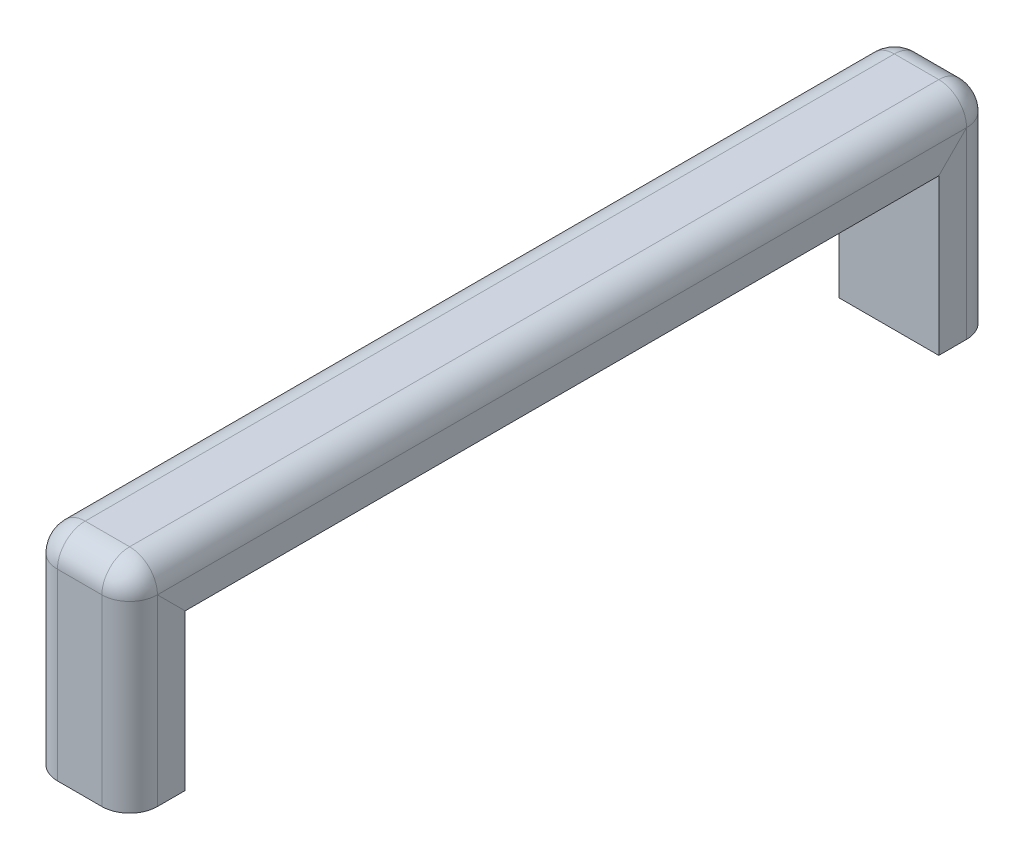
ISO-10303-21;
HEADER;
FILE_DESCRIPTION(('STEP AP214'),'2;1');
FILE_NAME('part.step','',(''),(''),'','','');
FILE_SCHEMA(('AUTOMOTIVE_DESIGN { 1 0 10303 214 1 1 1 1 }'));
ENDSEC;
DATA;
#1=APPLICATION_CONTEXT('core data for automotive mechanical design processes');
#2=APPLICATION_PROTOCOL_DEFINITION('international standard','automotive_design',2000,#1);
#3=PRODUCT_CONTEXT('',#1,'mechanical');
#4=PRODUCT('Part','Part','',(#3));
#5=PRODUCT_RELATED_PRODUCT_CATEGORY('part','',(#4));
#6=PRODUCT_DEFINITION_FORMATION('','',#4);
#7=PRODUCT_DEFINITION_CONTEXT('part definition',#1,'design');
#8=PRODUCT_DEFINITION('design','',#6,#7);
#9=PRODUCT_DEFINITION_SHAPE('','',#8);
#10=(LENGTH_UNIT() NAMED_UNIT(*) SI_UNIT(.MILLI.,.METRE.));
#11=(NAMED_UNIT(*) PLANE_ANGLE_UNIT() SI_UNIT($,.RADIAN.));
#12=(NAMED_UNIT(*) SI_UNIT($,.STERADIAN.) SOLID_ANGLE_UNIT());
#13=UNCERTAINTY_MEASURE_WITH_UNIT(LENGTH_MEASURE(1.E-05),#10,'distance_accuracy_value','');
#14=(GEOMETRIC_REPRESENTATION_CONTEXT(3) GLOBAL_UNCERTAINTY_ASSIGNED_CONTEXT((#13)) GLOBAL_UNIT_ASSIGNED_CONTEXT((#10,
#11,#12)) REPRESENTATION_CONTEXT('',''));
#15=CARTESIAN_POINT('',(0.,0.,0.));
#16=DIRECTION('',(0.,0.,1.));
#17=DIRECTION('',(1.,0.,0.));
#18=AXIS2_PLACEMENT_3D('',#15,#16,#17);
#19=CARTESIAN_POINT('',(82.55,-177.8635,462.50225));
#20=DIRECTION('',(0.,-1.,0.));
#21=DIRECTION('',(0.,0.,-1.));
#22=AXIS2_PLACEMENT_3D('',#19,#20,#21);
#23=PLANE('',#22);
#24=DIRECTION('',(0.,0.,1.));
#25=VECTOR('',#24,1.);
#26=CARTESIAN_POINT('',(0.,-177.8635,462.50225));
#27=LINE('',#26,#25);
#28=CARTESIAN_POINT('',(0.,-177.8635,430.75225));
#29=VERTEX_POINT('',#28);
#30=CARTESIAN_POINT('',(0.,-177.8635,462.50225));
#31=VERTEX_POINT('',#30);
#32=EDGE_CURVE('E223',#29,#31,#27,.T.);
#33=ORIENTED_EDGE('',*,*,#32,.F.);
#34=DIRECTION('',(-1.,0.,0.));
#35=VECTOR('',#34,1.);
#36=CARTESIAN_POINT('',(0.,-177.8635,430.75225));
#37=LINE('',#36,#35);
#38=CARTESIAN_POINT('',(114.3,-177.8635,430.75225));
#39=VERTEX_POINT('',#38);
#40=EDGE_CURVE('E225',#39,#29,#37,.T.);
#41=ORIENTED_EDGE('',*,*,#40,.F.);
#42=DIRECTION('',(0.,0.,-1.));
#43=VECTOR('',#42,1.);
#44=CARTESIAN_POINT('',(114.3,-177.8635,430.75225));
#45=LINE('',#44,#43);
#46=CARTESIAN_POINT('',(114.3,-177.8635,462.50225));
#47=VERTEX_POINT('',#46);
#48=EDGE_CURVE('E212',#47,#39,#45,.T.);
#49=ORIENTED_EDGE('',*,*,#48,.F.);
#50=CARTESIAN_POINT('',(82.55,-177.8635,462.50225));
#51=DIRECTION('',(0.,1.,0.));
#52=DIRECTION('',(0.,0.,-1.));
#53=AXIS2_PLACEMENT_3D('',#50,#51,#52);
#54=CIRCLE('',#53,31.75);
#55=CARTESIAN_POINT('',(82.55,-177.8635,494.25225));
#56=VERTEX_POINT('',#55);
#57=EDGE_CURVE('E214',#56,#47,#54,.T.);
#58=ORIENTED_EDGE('',*,*,#57,.F.);
#59=DIRECTION('',(1.,0.,0.));
#60=VECTOR('',#59,1.);
#61=CARTESIAN_POINT('',(82.55,-177.8635,494.25225));
#62=LINE('',#61,#60);
#63=CARTESIAN_POINT('',(31.75,-177.8635,494.25225));
#64=VERTEX_POINT('',#63);
#65=EDGE_CURVE('E217',#64,#56,#62,.T.);
#66=ORIENTED_EDGE('',*,*,#65,.F.);
#67=CARTESIAN_POINT('',(31.75,-177.8635,462.50225));
#68=DIRECTION('',(0.,1.,0.));
#69=DIRECTION('',(0.,0.,-1.));
#70=AXIS2_PLACEMENT_3D('',#67,#68,#69);
#71=CIRCLE('',#70,31.75);
#72=EDGE_CURVE('E220',#31,#64,#71,.T.);
#73=ORIENTED_EDGE('',*,*,#72,.F.);
#74=EDGE_LOOP('',(#33,#41,#49,#58,#66,#73));
#75=FACE_BOUND('',#74,.T.);
#76=ADVANCED_FACE('F34',(#75),#23,.T.);
#77=CARTESIAN_POINT('',(82.55,-177.8635,-462.50225));
#78=DIRECTION('',(0.,1.,0.));
#79=DIRECTION('',(0.,0.,1.));
#80=AXIS2_PLACEMENT_3D('',#77,#78,#79);
#81=PLANE('',#80);
#82=DIRECTION('',(0.,0.,-1.));
#83=VECTOR('',#82,1.);
#84=CARTESIAN_POINT('',(0.,-177.8635,-462.50225));
#85=LINE('',#84,#83);
#86=CARTESIAN_POINT('',(0.,-177.8635,-430.75225));
#87=VERTEX_POINT('',#86);
#88=CARTESIAN_POINT('',(0.,-177.8635,-462.50225));
#89=VERTEX_POINT('',#88);
#90=EDGE_CURVE('E148',#87,#89,#85,.T.);
#91=ORIENTED_EDGE('',*,*,#90,.T.);
#92=CARTESIAN_POINT('',(31.75,-177.8635,-462.50225));
#93=DIRECTION('',(0.,-1.,0.));
#94=DIRECTION('',(0.,0.,1.));
#95=AXIS2_PLACEMENT_3D('',#92,#93,#94);
#96=CIRCLE('',#95,31.75);
#97=CARTESIAN_POINT('',(31.75,-177.8635,-494.25225));
#98=VERTEX_POINT('',#97);
#99=EDGE_CURVE('E169',#89,#98,#96,.T.);
#100=ORIENTED_EDGE('',*,*,#99,.T.);
#101=DIRECTION('',(1.,0.,0.));
#102=VECTOR('',#101,1.);
#103=CARTESIAN_POINT('',(82.55,-177.8635,-494.25225));
#104=LINE('',#103,#102);
#105=CARTESIAN_POINT('',(82.55,-177.8635,-494.25225));
#106=VERTEX_POINT('',#105);
#107=EDGE_CURVE('E174',#98,#106,#104,.T.);
#108=ORIENTED_EDGE('',*,*,#107,.T.);
#109=CARTESIAN_POINT('',(82.55,-177.8635,-462.50225));
#110=DIRECTION('',(0.,-1.,0.));
#111=DIRECTION('',(0.,0.,1.));
#112=AXIS2_PLACEMENT_3D('',#109,#110,#111);
#113=CIRCLE('',#112,31.75);
#114=CARTESIAN_POINT('',(114.3,-177.8635,-462.50225));
#115=VERTEX_POINT('',#114);
#116=EDGE_CURVE('E155',#106,#115,#113,.T.);
#117=ORIENTED_EDGE('',*,*,#116,.T.);
#118=DIRECTION('',(0.,0.,1.));
#119=VECTOR('',#118,1.);
#120=CARTESIAN_POINT('',(114.3,-177.8635,-430.75225));
#121=LINE('',#120,#119);
#122=CARTESIAN_POINT('',(114.3,-177.8635,-430.75225));
#123=VERTEX_POINT('',#122);
#124=EDGE_CURVE('E152',#115,#123,#121,.T.);
#125=ORIENTED_EDGE('',*,*,#124,.T.);
#126=DIRECTION('',(-1.,0.,0.));
#127=VECTOR('',#126,1.);
#128=CARTESIAN_POINT('',(0.,-177.8635,-430.75225));
#129=LINE('',#128,#127);
#130=EDGE_CURVE('E139',#123,#87,#129,.T.);
#131=ORIENTED_EDGE('',*,*,#130,.T.);
#132=EDGE_LOOP('',(#91,#100,#108,#117,#125,#131));
#133=FACE_BOUND('',#132,.T.);
#134=ADVANCED_FACE('F153',(#133),#81,.F.);
#135=CARTESIAN_POINT('',(0.,69.95,430.75225));
#136=DIRECTION('',(0.,0.,1.));
#137=DIRECTION('',(1.,0.,0.));
#138=AXIS2_PLACEMENT_3D('',#135,#136,#137);
#139=PLANE('',#138);
#140=DIRECTION('',(1.,0.,0.));
#141=VECTOR('',#140,1.);
#142=CARTESIAN_POINT('',(0.,0.,430.75225));
#143=LINE('',#142,#141);
#144=CARTESIAN_POINT('',(0.,0.,430.75225));
#145=VERTEX_POINT('',#144);
#146=CARTESIAN_POINT('',(114.3,0.,430.75225));
#147=VERTEX_POINT('',#146);
#148=EDGE_CURVE('E190',#145,#147,#143,.T.);
#149=ORIENTED_EDGE('',*,*,#148,.T.);
#150=DIRECTION('',(0.,-1.,0.));
#151=VECTOR('',#150,1.);
#152=CARTESIAN_POINT('',(114.3,69.95,430.75225));
#153=LINE('',#152,#151);
#154=EDGE_CURVE('E195',#147,#39,#153,.T.);
#155=ORIENTED_EDGE('',*,*,#154,.T.);
#156=ORIENTED_EDGE('',*,*,#40,.T.);
#157=DIRECTION('',(0.,-1.,0.));
#158=VECTOR('',#157,1.);
#159=CARTESIAN_POINT('',(0.,69.95,430.75225));
#160=LINE('',#159,#158);
#161=EDGE_CURVE('E237',#145,#29,#160,.T.);
#162=ORIENTED_EDGE('',*,*,#161,.F.);
#163=EDGE_LOOP('',(#149,#155,#156,#162));
#164=FACE_BOUND('',#163,.T.);
#165=ADVANCED_FACE('F333',(#164),#139,.F.);
#166=CARTESIAN_POINT('',(0.,69.95,462.50225));
#167=DIRECTION('',(1.,0.,0.));
#168=DIRECTION('',(0.,0.,-1.));
#169=AXIS2_PLACEMENT_3D('',#166,#167,#168);
#170=PLANE('',#169);
#171=DIRECTION('',(0.,-0.707106781186547,-0.707106781186548));
#172=VECTOR('',#171,1.);
#173=CARTESIAN_POINT('',(0.,-449.85225,-19.1000000000002));
#174=LINE('',#173,#172);
#175=CARTESIAN_POINT('',(0.,31.75,462.50225));
#176=VERTEX_POINT('',#175);
#177=EDGE_CURVE('E149',#176,#145,#174,.T.);
#178=ORIENTED_EDGE('',*,*,#177,.T.);
#179=ORIENTED_EDGE('',*,*,#161,.T.);
#180=ORIENTED_EDGE('',*,*,#32,.T.);
#181=DIRECTION('',(0.,-1.,0.));
#182=VECTOR('',#181,1.);
#183=CARTESIAN_POINT('',(0.,69.95,462.50225));
#184=LINE('',#183,#182);
#185=EDGE_CURVE('E234',#176,#31,#184,.T.);
#186=ORIENTED_EDGE('',*,*,#185,.F.);
#187=EDGE_LOOP('',(#178,#179,#180,#186));
#188=FACE_BOUND('',#187,.T.);
#189=ADVANCED_FACE('F337',(#188),#170,.F.);
#190=CARTESIAN_POINT('',(31.75,69.95,462.50225));
#191=DIRECTION('',(0.,-1.,0.));
#192=DIRECTION('',(0.,0.,-1.));
#193=AXIS2_PLACEMENT_3D('',#190,#191,#192);
#194=CYLINDRICAL_SURFACE('',#193,31.75);
#195=DIRECTION('',(0.,-1.,0.));
#196=VECTOR('',#195,1.);
#197=CARTESIAN_POINT('',(31.75,69.95,494.25225));
#198=LINE('',#197,#196);
#199=CARTESIAN_POINT('',(31.75,31.75,494.25225));
#200=VERTEX_POINT('',#199);
#201=EDGE_CURVE('E232',#200,#64,#198,.T.);
#202=ORIENTED_EDGE('',*,*,#201,.F.);
#203=CARTESIAN_POINT('',(31.75,31.75,462.50225));
#204=DIRECTION('',(0.,-1.,0.));
#205=DIRECTION('',(0.,0.,-1.));
#206=AXIS2_PLACEMENT_3D('',#203,#204,#205);
#207=CIRCLE('',#206,31.75);
#208=EDGE_CURVE('E251',#200,#176,#207,.T.);
#209=ORIENTED_EDGE('',*,*,#208,.T.);
#210=ORIENTED_EDGE('',*,*,#185,.T.);
#211=ORIENTED_EDGE('',*,*,#72,.T.);
#212=EDGE_LOOP('',(#202,#209,#210,#211));
#213=FACE_BOUND('',#212,.T.);
#214=ADVANCED_FACE('F341',(#213),#194,.T.);
#215=CARTESIAN_POINT('',(82.55,69.95,494.25225));
#216=DIRECTION('',(0.,0.,-1.));
#217=DIRECTION('',(-1.,0.,0.));
#218=AXIS2_PLACEMENT_3D('',#215,#216,#217);
#219=PLANE('',#218);
#220=DIRECTION('',(0.,-1.,0.));
#221=VECTOR('',#220,1.);
#222=CARTESIAN_POINT('',(82.55,69.95,494.25225));
#223=LINE('',#222,#221);
#224=CARTESIAN_POINT('',(82.55,31.75,494.25225));
#225=VERTEX_POINT('',#224);
#226=EDGE_CURVE('E230',#225,#56,#223,.T.);
#227=ORIENTED_EDGE('',*,*,#226,.F.);
#228=DIRECTION('',(-1.,0.,0.));
#229=VECTOR('',#228,1.);
#230=CARTESIAN_POINT('',(82.55,31.75,494.25225));
#231=LINE('',#230,#229);
#232=EDGE_CURVE('E260',#225,#200,#231,.T.);
#233=ORIENTED_EDGE('',*,*,#232,.T.);
#234=ORIENTED_EDGE('',*,*,#201,.T.);
#235=ORIENTED_EDGE('',*,*,#65,.T.);
#236=EDGE_LOOP('',(#227,#233,#234,#235));
#237=FACE_BOUND('',#236,.T.);
#238=ADVANCED_FACE('F497',(#237),#219,.F.);
#239=CARTESIAN_POINT('',(82.55,69.95,462.50225));
#240=DIRECTION('',(0.,-1.,0.));
#241=DIRECTION('',(0.,0.,-1.));
#242=AXIS2_PLACEMENT_3D('',#239,#240,#241);
#243=CYLINDRICAL_SURFACE('',#242,31.75);
#244=DIRECTION('',(0.,-1.,0.));
#245=VECTOR('',#244,1.);
#246=CARTESIAN_POINT('',(114.3,69.95,462.50225));
#247=LINE('',#246,#245);
#248=CARTESIAN_POINT('',(114.3,31.75,462.50225));
#249=VERTEX_POINT('',#248);
#250=EDGE_CURVE('E227',#249,#47,#247,.T.);
#251=ORIENTED_EDGE('',*,*,#250,.F.);
#252=CARTESIAN_POINT('',(82.55,31.75,462.50225));
#253=DIRECTION('',(0.,-1.,0.));
#254=DIRECTION('',(0.,0.,-1.));
#255=AXIS2_PLACEMENT_3D('',#252,#253,#254);
#256=CIRCLE('',#255,31.75);
#257=EDGE_CURVE('E242',#249,#225,#256,.T.);
#258=ORIENTED_EDGE('',*,*,#257,.T.);
#259=ORIENTED_EDGE('',*,*,#226,.T.);
#260=ORIENTED_EDGE('',*,*,#57,.T.);
#261=EDGE_LOOP('',(#251,#258,#259,#260));
#262=FACE_BOUND('',#261,.T.);
#263=ADVANCED_FACE('F318',(#262),#243,.T.);
#264=CARTESIAN_POINT('',(114.3,69.95,430.75225));
#265=DIRECTION('',(-1.,0.,0.));
#266=DIRECTION('',(0.,0.,1.));
#267=AXIS2_PLACEMENT_3D('',#264,#265,#266);
#268=PLANE('',#267);
#269=DIRECTION('',(0.,0.707106781186547,0.707106781186548));
#270=VECTOR('',#269,1.);
#271=CARTESIAN_POINT('',(114.3,-465.72725,-34.9750000000001));
#272=LINE('',#271,#270);
#273=EDGE_CURVE('E187',#147,#249,#272,.T.);
#274=ORIENTED_EDGE('',*,*,#273,.T.);
#275=ORIENTED_EDGE('',*,*,#250,.T.);
#276=ORIENTED_EDGE('',*,*,#48,.T.);
#277=ORIENTED_EDGE('',*,*,#154,.F.);
#278=EDGE_LOOP('',(#274,#275,#276,#277));
#279=FACE_BOUND('',#278,.T.);
#280=ADVANCED_FACE('F324',(#279),#268,.F.);
#281=CARTESIAN_POINT('',(114.3,1.66533453693773E-13,-500.70225));
#282=DIRECTION('',(-1.,0.,0.));
#283=DIRECTION('',(0.,-1.,0.));
#284=AXIS2_PLACEMENT_3D('',#281,#282,#283);
#285=PLANE('',#284);
#286=DIRECTION('',(0.,0.,1.));
#287=VECTOR('',#286,1.);
#288=CARTESIAN_POINT('',(114.3,1.66533453693773E-13,-500.70225));
#289=LINE('',#288,#287);
#290=CARTESIAN_POINT('',(114.3,1.60108650423747E-13,-430.75225));
#291=VERTEX_POINT('',#290);
#292=EDGE_CURVE('E207',#291,#147,#289,.T.);
#293=ORIENTED_EDGE('',*,*,#292,.F.);
#294=DIRECTION('',(0.,0.707106781186548,-0.707106781186547));
#295=VECTOR('',#294,1.);
#296=CARTESIAN_POINT('',(114.3,-88.9317499999999,-341.8205));
#297=LINE('',#296,#295);
#298=CARTESIAN_POINT('',(114.3,31.7500000000002,-462.50225));
#299=VERTEX_POINT('',#298);
#300=EDGE_CURVE('E162',#291,#299,#297,.T.);
#301=ORIENTED_EDGE('',*,*,#300,.T.);
#302=DIRECTION('',(0.,0.,1.));
#303=VECTOR('',#302,1.);
#304=CARTESIAN_POINT('',(114.3,31.7500000000002,-500.70225));
#305=LINE('',#304,#303);
#306=EDGE_CURVE('E191',#299,#249,#305,.T.);
#307=ORIENTED_EDGE('',*,*,#306,.T.);
#308=ORIENTED_EDGE('',*,*,#273,.F.);
#309=EDGE_LOOP('',(#293,#301,#307,#308));
#310=FACE_BOUND('',#309,.T.);
#311=ADVANCED_FACE('F326',(#310),#285,.F.);
#312=CARTESIAN_POINT('',(82.55,31.7500000000002,-500.70225));
#313=DIRECTION('',(0.,0.,1.));
#314=DIRECTION('',(0.,-1.,0.));
#315=AXIS2_PLACEMENT_3D('',#312,#313,#314);
#316=CYLINDRICAL_SURFACE('',#315,31.75);
#317=DIRECTION('',(0.,0.,1.));
#318=VECTOR('',#317,1.);
#319=CARTESIAN_POINT('',(82.55,63.5000000000002,-500.70225));
#320=LINE('',#319,#318);
#321=CARTESIAN_POINT('',(82.55,63.5000000000002,-462.50225));
#322=VERTEX_POINT('',#321);
#323=CARTESIAN_POINT('',(82.55,63.5,462.50225));
#324=VERTEX_POINT('',#323);
#325=EDGE_CURVE('E194',#322,#324,#320,.T.);
#326=ORIENTED_EDGE('',*,*,#325,.T.);
#327=CARTESIAN_POINT('',(82.55,31.75,462.50225));
#328=DIRECTION('',(0.,0.,1.));
#329=DIRECTION('',(0.,-1.,0.));
#330=AXIS2_PLACEMENT_3D('',#327,#328,#329);
#331=CIRCLE('',#330,31.75);
#332=EDGE_CURVE('E249',#324,#249,#331,.F.);
#333=ORIENTED_EDGE('',*,*,#332,.T.);
#334=ORIENTED_EDGE('',*,*,#306,.F.);
#335=CARTESIAN_POINT('',(82.55,31.7500000000002,-462.50225));
#336=DIRECTION('',(0.,0.,1.));
#337=DIRECTION('',(0.,-1.,0.));
#338=AXIS2_PLACEMENT_3D('',#335,#336,#337);
#339=CIRCLE('',#338,31.75);
#340=EDGE_CURVE('E245',#299,#322,#339,.T.);
#341=ORIENTED_EDGE('',*,*,#340,.T.);
#342=EDGE_LOOP('',(#326,#333,#334,#341));
#343=FACE_BOUND('',#342,.T.);
#344=ADVANCED_FACE('F303',(#343),#316,.T.);
#345=CARTESIAN_POINT('',(82.55,63.5000000000002,-500.70225));
#346=DIRECTION('',(0.,-1.,0.));
#347=DIRECTION('',(0.,0.,-1.));
#348=AXIS2_PLACEMENT_3D('',#345,#346,#347);
#349=PLANE('',#348);
#350=DIRECTION('',(0.,0.,1.));
#351=VECTOR('',#350,1.);
#352=CARTESIAN_POINT('',(31.75,63.5000000000002,-500.70225));
#353=LINE('',#352,#351);
#354=CARTESIAN_POINT('',(31.75,63.5000000000002,-462.50225));
#355=VERTEX_POINT('',#354);
#356=CARTESIAN_POINT('',(31.75,63.5,462.50225));
#357=VERTEX_POINT('',#356);
#358=EDGE_CURVE('E198',#355,#357,#353,.T.);
#359=ORIENTED_EDGE('',*,*,#358,.T.);
#360=DIRECTION('',(-1.,0.,0.));
#361=VECTOR('',#360,1.);
#362=CARTESIAN_POINT('',(82.55,63.5,462.50225));
#363=LINE('',#362,#361);
#364=EDGE_CURVE('E43',#357,#324,#363,.F.);
#365=ORIENTED_EDGE('',*,*,#364,.T.);
#366=ORIENTED_EDGE('',*,*,#325,.F.);
#367=DIRECTION('',(-1.,0.,0.));
#368=VECTOR('',#367,1.);
#369=CARTESIAN_POINT('',(82.55,63.5000000000002,-462.50225));
#370=LINE('',#369,#368);
#371=EDGE_CURVE('E262',#322,#355,#370,.T.);
#372=ORIENTED_EDGE('',*,*,#371,.T.);
#373=EDGE_LOOP('',(#359,#365,#366,#372));
#374=FACE_BOUND('',#373,.T.);
#375=ADVANCED_FACE('F306',(#374),#349,.F.);
#376=CARTESIAN_POINT('',(31.75,31.7500000000002,-500.70225));
#377=DIRECTION('',(0.,0.,1.));
#378=DIRECTION('',(0.,-1.,0.));
#379=AXIS2_PLACEMENT_3D('',#376,#377,#378);
#380=CYLINDRICAL_SURFACE('',#379,31.75);
#381=DIRECTION('',(0.,0.,1.));
#382=VECTOR('',#381,1.);
#383=CARTESIAN_POINT('',(0.,31.7500000000002,-500.70225));
#384=LINE('',#383,#382);
#385=CARTESIAN_POINT('',(0.,31.7500000000002,-462.50225));
#386=VERTEX_POINT('',#385);
#387=EDGE_CURVE('E201',#386,#176,#384,.T.);
#388=ORIENTED_EDGE('',*,*,#387,.T.);
#389=CARTESIAN_POINT('',(31.75,31.75,462.50225));
#390=DIRECTION('',(0.,0.,1.));
#391=DIRECTION('',(0.,-1.,0.));
#392=AXIS2_PLACEMENT_3D('',#389,#390,#391);
#393=CIRCLE('',#392,31.75);
#394=EDGE_CURVE('E255',#176,#357,#393,.F.);
#395=ORIENTED_EDGE('',*,*,#394,.T.);
#396=ORIENTED_EDGE('',*,*,#358,.F.);
#397=CARTESIAN_POINT('',(31.75,31.7500000000002,-462.50225));
#398=DIRECTION('',(0.,0.,1.));
#399=DIRECTION('',(0.,-1.,0.));
#400=AXIS2_PLACEMENT_3D('',#397,#398,#399);
#401=CIRCLE('',#400,31.75);
#402=EDGE_CURVE('E253',#355,#386,#401,.T.);
#403=ORIENTED_EDGE('',*,*,#402,.T.);
#404=EDGE_LOOP('',(#388,#395,#396,#403));
#405=FACE_BOUND('',#404,.T.);
#406=ADVANCED_FACE('F283',(#405),#380,.T.);
#407=CARTESIAN_POINT('',(0.,31.7500000000002,-500.70225));
#408=DIRECTION('',(1.,0.,0.));
#409=DIRECTION('',(0.,0.,-1.));
#410=AXIS2_PLACEMENT_3D('',#407,#408,#409);
#411=PLANE('',#410);
#412=ORIENTED_EDGE('',*,*,#387,.F.);
#413=DIRECTION('',(0.,-0.707106781186548,0.707106781186547));
#414=VECTOR('',#413,1.);
#415=CARTESIAN_POINT('',(0.,-73.0567499999999,-357.6955));
#416=LINE('',#415,#414);
#417=CARTESIAN_POINT('',(0.,1.60108650423747E-13,-430.75225));
#418=VERTEX_POINT('',#417);
#419=EDGE_CURVE('E246',#386,#418,#416,.T.);
#420=ORIENTED_EDGE('',*,*,#419,.T.);
#421=DIRECTION('',(0.,0.,1.));
#422=VECTOR('',#421,1.);
#423=CARTESIAN_POINT('',(0.,1.66533453693773E-13,-500.70225));
#424=LINE('',#423,#422);
#425=EDGE_CURVE('E204',#418,#145,#424,.T.);
#426=ORIENTED_EDGE('',*,*,#425,.T.);
#427=ORIENTED_EDGE('',*,*,#177,.F.);
#428=EDGE_LOOP('',(#412,#420,#426,#427));
#429=FACE_BOUND('',#428,.T.);
#430=ADVANCED_FACE('F293',(#429),#411,.F.);
#431=CARTESIAN_POINT('',(0.,1.66533453693773E-13,-500.70225));
#432=DIRECTION('',(0.,1.,0.));
#433=DIRECTION('',(0.,0.,1.));
#434=AXIS2_PLACEMENT_3D('',#431,#432,#433);
#435=PLANE('',#434);
#436=ORIENTED_EDGE('',*,*,#425,.F.);
#437=DIRECTION('',(1.,0.,0.));
#438=VECTOR('',#437,1.);
#439=CARTESIAN_POINT('',(0.,1.66533453693773E-13,-430.75225));
#440=LINE('',#439,#438);
#441=EDGE_CURVE('E181',#418,#291,#440,.T.);
#442=ORIENTED_EDGE('',*,*,#441,.T.);
#443=ORIENTED_EDGE('',*,*,#292,.T.);
#444=ORIENTED_EDGE('',*,*,#148,.F.);
#445=EDGE_LOOP('',(#436,#442,#443,#444));
#446=FACE_BOUND('',#445,.T.);
#447=ADVANCED_FACE('F330',(#446),#435,.F.);
#448=CARTESIAN_POINT('',(114.3,-177.8635,-430.75225));
#449=DIRECTION('',(-1.,0.,0.));
#450=DIRECTION('',(0.,0.,1.));
#451=AXIS2_PLACEMENT_3D('',#448,#449,#450);
#452=PLANE('',#451);
#453=DIRECTION('',(0.,1.,0.));
#454=VECTOR('',#453,1.);
#455=CARTESIAN_POINT('',(114.3,-177.8635,-430.75225));
#456=LINE('',#455,#454);
#457=EDGE_CURVE('E143',#123,#291,#456,.T.);
#458=ORIENTED_EDGE('',*,*,#457,.F.);
#459=ORIENTED_EDGE('',*,*,#124,.F.);
#460=DIRECTION('',(0.,1.,0.));
#461=VECTOR('',#460,1.);
#462=CARTESIAN_POINT('',(114.3,-177.8635,-462.50225));
#463=LINE('',#462,#461);
#464=EDGE_CURVE('E179',#115,#299,#463,.T.);
#465=ORIENTED_EDGE('',*,*,#464,.T.);
#466=ORIENTED_EDGE('',*,*,#300,.F.);
#467=EDGE_LOOP('',(#458,#459,#465,#466));
#468=FACE_BOUND('',#467,.T.);
#469=ADVANCED_FACE('F160',(#468),#452,.F.);
#470=CARTESIAN_POINT('',(82.55,-177.8635,-462.50225));
#471=DIRECTION('',(0.,1.,0.));
#472=DIRECTION('',(0.,0.,1.));
#473=AXIS2_PLACEMENT_3D('',#470,#471,#472);
#474=CYLINDRICAL_SURFACE('',#473,31.75);
#475=DIRECTION('',(0.,1.,0.));
#476=VECTOR('',#475,1.);
#477=CARTESIAN_POINT('',(82.55,-177.8635,-494.25225));
#478=LINE('',#477,#476);
#479=CARTESIAN_POINT('',(82.55,31.7500000000002,-494.25225));
#480=VERTEX_POINT('',#479);
#481=EDGE_CURVE('E176',#106,#480,#478,.T.);
#482=ORIENTED_EDGE('',*,*,#481,.T.);
#483=CARTESIAN_POINT('',(82.55,31.7500000000002,-462.50225));
#484=DIRECTION('',(0.,1.,0.));
#485=DIRECTION('',(0.,0.,1.));
#486=AXIS2_PLACEMENT_3D('',#483,#484,#485);
#487=CIRCLE('',#486,31.75);
#488=EDGE_CURVE('E257',#480,#299,#487,.F.);
#489=ORIENTED_EDGE('',*,*,#488,.T.);
#490=ORIENTED_EDGE('',*,*,#464,.F.);
#491=ORIENTED_EDGE('',*,*,#116,.F.);
#492=EDGE_LOOP('',(#482,#489,#490,#491));
#493=FACE_BOUND('',#492,.T.);
#494=ADVANCED_FACE('F298',(#493),#474,.T.);
#495=CARTESIAN_POINT('',(82.55,-177.8635,-494.25225));
#496=DIRECTION('',(0.,0.,1.));
#497=DIRECTION('',(0.,-1.,0.));
#498=AXIS2_PLACEMENT_3D('',#495,#496,#497);
#499=PLANE('',#498);
#500=DIRECTION('',(0.,1.,0.));
#501=VECTOR('',#500,1.);
#502=CARTESIAN_POINT('',(31.75,-177.8635,-494.25225));
#503=LINE('',#502,#501);
#504=CARTESIAN_POINT('',(31.75,31.7500000000002,-494.25225));
#505=VERTEX_POINT('',#504);
#506=EDGE_CURVE('E171',#98,#505,#503,.T.);
#507=ORIENTED_EDGE('',*,*,#506,.T.);
#508=DIRECTION('',(-1.,0.,0.));
#509=VECTOR('',#508,1.);
#510=CARTESIAN_POINT('',(82.55,31.7500000000002,-494.25225));
#511=LINE('',#510,#509);
#512=EDGE_CURVE('E11',#505,#480,#511,.F.);
#513=ORIENTED_EDGE('',*,*,#512,.T.);
#514=ORIENTED_EDGE('',*,*,#481,.F.);
#515=ORIENTED_EDGE('',*,*,#107,.F.);
#516=EDGE_LOOP('',(#507,#513,#514,#515));
#517=FACE_BOUND('',#516,.T.);
#518=ADVANCED_FACE('F296',(#517),#499,.F.);
#519=CARTESIAN_POINT('',(31.75,-177.8635,-462.50225));
#520=DIRECTION('',(0.,1.,0.));
#521=DIRECTION('',(0.,0.,1.));
#522=AXIS2_PLACEMENT_3D('',#519,#520,#521);
#523=CYLINDRICAL_SURFACE('',#522,31.75);
#524=DIRECTION('',(0.,1.,0.));
#525=VECTOR('',#524,1.);
#526=CARTESIAN_POINT('',(0.,-177.8635,-462.50225));
#527=LINE('',#526,#525);
#528=EDGE_CURVE('E165',#89,#386,#527,.T.);
#529=ORIENTED_EDGE('',*,*,#528,.T.);
#530=CARTESIAN_POINT('',(31.75,31.7500000000002,-462.50225));
#531=DIRECTION('',(0.,1.,0.));
#532=DIRECTION('',(0.,0.,1.));
#533=AXIS2_PLACEMENT_3D('',#530,#531,#532);
#534=CIRCLE('',#533,31.75);
#535=EDGE_CURVE('E51',#386,#505,#534,.F.);
#536=ORIENTED_EDGE('',*,*,#535,.T.);
#537=ORIENTED_EDGE('',*,*,#506,.F.);
#538=ORIENTED_EDGE('',*,*,#99,.F.);
#539=EDGE_LOOP('',(#529,#536,#537,#538));
#540=FACE_BOUND('',#539,.T.);
#541=ADVANCED_FACE('F295',(#540),#523,.T.);
#542=CARTESIAN_POINT('',(0.,-177.8635,-462.50225));
#543=DIRECTION('',(1.,0.,0.));
#544=DIRECTION('',(0.,0.,-1.));
#545=AXIS2_PLACEMENT_3D('',#542,#543,#544);
#546=PLANE('',#545);
#547=ORIENTED_EDGE('',*,*,#528,.F.);
#548=ORIENTED_EDGE('',*,*,#90,.F.);
#549=DIRECTION('',(0.,1.,0.));
#550=VECTOR('',#549,1.);
#551=CARTESIAN_POINT('',(0.,-177.8635,-430.75225));
#552=LINE('',#551,#550);
#553=EDGE_CURVE('E145',#87,#418,#552,.T.);
#554=ORIENTED_EDGE('',*,*,#553,.T.);
#555=ORIENTED_EDGE('',*,*,#419,.F.);
#556=EDGE_LOOP('',(#547,#548,#554,#555));
#557=FACE_BOUND('',#556,.T.);
#558=ADVANCED_FACE('F289',(#557),#546,.F.);
#559=CARTESIAN_POINT('',(0.,-177.8635,-430.75225));
#560=DIRECTION('',(0.,0.,-1.));
#561=DIRECTION('',(0.,1.,0.));
#562=AXIS2_PLACEMENT_3D('',#559,#560,#561);
#563=PLANE('',#562);
#564=ORIENTED_EDGE('',*,*,#553,.F.);
#565=ORIENTED_EDGE('',*,*,#130,.F.);
#566=ORIENTED_EDGE('',*,*,#457,.T.);
#567=ORIENTED_EDGE('',*,*,#441,.F.);
#568=EDGE_LOOP('',(#564,#565,#566,#567));
#569=FACE_BOUND('',#568,.T.);
#570=ADVANCED_FACE('F141',(#569),#563,.F.);
#571=CARTESIAN_POINT('',(31.75,31.75,462.50225));
#572=DIRECTION('',(0.,0.,1.));
#573=DIRECTION('',(1.,0.,0.));
#574=AXIS2_PLACEMENT_3D('',#571,#572,#573);
#575=SPHERICAL_SURFACE('',#574,31.75);
#576=ORIENTED_EDGE('',*,*,#394,.F.);
#577=ORIENTED_EDGE('',*,*,#208,.F.);
#578=CARTESIAN_POINT('',(31.75,31.75,462.50225));
#579=DIRECTION('',(1.,0.,0.));
#580=DIRECTION('',(0.,1.,0.));
#581=AXIS2_PLACEMENT_3D('',#578,#579,#580);
#582=CIRCLE('',#581,31.75);
#583=EDGE_CURVE('E215',#357,#200,#582,.T.);
#584=ORIENTED_EDGE('',*,*,#583,.F.);
#585=EDGE_LOOP('',(#576,#577,#584));
#586=FACE_BOUND('',#585,.T.);
#587=ADVANCED_FACE('F345',(#586),#575,.T.);
#588=CARTESIAN_POINT('',(82.55,31.75,462.50225));
#589=DIRECTION('',(-1.,0.,0.));
#590=DIRECTION('',(0.,0.,1.));
#591=AXIS2_PLACEMENT_3D('',#588,#589,#590);
#592=CYLINDRICAL_SURFACE('',#591,31.75);
#593=ORIENTED_EDGE('',*,*,#583,.T.);
#594=ORIENTED_EDGE('',*,*,#232,.F.);
#595=CARTESIAN_POINT('',(82.55,31.75,462.50225));
#596=DIRECTION('',(1.,0.,0.));
#597=DIRECTION('',(0.,0.,-1.));
#598=AXIS2_PLACEMENT_3D('',#595,#596,#597);
#599=CIRCLE('',#598,31.75);
#600=EDGE_CURVE('E265',#324,#225,#599,.T.);
#601=ORIENTED_EDGE('',*,*,#600,.F.);
#602=ORIENTED_EDGE('',*,*,#364,.F.);
#603=EDGE_LOOP('',(#593,#594,#601,#602));
#604=FACE_BOUND('',#603,.T.);
#605=ADVANCED_FACE('F311',(#604),#592,.T.);
#606=CARTESIAN_POINT('',(82.55,31.75,462.50225));
#607=DIRECTION('',(0.,0.,1.));
#608=DIRECTION('',(1.,0.,0.));
#609=AXIS2_PLACEMENT_3D('',#606,#607,#608);
#610=SPHERICAL_SURFACE('',#609,31.75);
#611=ORIENTED_EDGE('',*,*,#257,.F.);
#612=ORIENTED_EDGE('',*,*,#332,.F.);
#613=ORIENTED_EDGE('',*,*,#600,.T.);
#614=EDGE_LOOP('',(#611,#612,#613));
#615=FACE_BOUND('',#614,.T.);
#616=ADVANCED_FACE('F315',(#615),#610,.T.);
#617=CARTESIAN_POINT('',(31.75,31.7500000000002,-462.50225));
#618=DIRECTION('',(0.,0.,1.));
#619=DIRECTION('',(1.,0.,0.));
#620=AXIS2_PLACEMENT_3D('',#617,#618,#619);
#621=SPHERICAL_SURFACE('',#620,31.75);
#622=ORIENTED_EDGE('',*,*,#535,.F.);
#623=ORIENTED_EDGE('',*,*,#402,.F.);
#624=CARTESIAN_POINT('',(31.75,31.7500000000002,-462.50225));
#625=DIRECTION('',(1.,0.,0.));
#626=DIRECTION('',(0.,1.,0.));
#627=AXIS2_PLACEMENT_3D('',#624,#625,#626);
#628=CIRCLE('',#627,31.75);
#629=EDGE_CURVE('E38',#505,#355,#628,.T.);
#630=ORIENTED_EDGE('',*,*,#629,.F.);
#631=EDGE_LOOP('',(#622,#623,#630));
#632=FACE_BOUND('',#631,.T.);
#633=ADVANCED_FACE('F36',(#632),#621,.T.);
#634=CARTESIAN_POINT('',(82.55,31.7500000000002,-462.50225));
#635=DIRECTION('',(-1.,0.,0.));
#636=DIRECTION('',(0.,0.,1.));
#637=AXIS2_PLACEMENT_3D('',#634,#635,#636);
#638=CYLINDRICAL_SURFACE('',#637,31.75);
#639=ORIENTED_EDGE('',*,*,#629,.T.);
#640=ORIENTED_EDGE('',*,*,#371,.F.);
#641=CARTESIAN_POINT('',(82.55,31.7500000000002,-462.50225));
#642=DIRECTION('',(1.,0.,0.));
#643=DIRECTION('',(0.,0.,-1.));
#644=AXIS2_PLACEMENT_3D('',#641,#642,#643);
#645=CIRCLE('',#644,31.75);
#646=EDGE_CURVE('E268',#480,#322,#645,.T.);
#647=ORIENTED_EDGE('',*,*,#646,.F.);
#648=ORIENTED_EDGE('',*,*,#512,.F.);
#649=EDGE_LOOP('',(#639,#640,#647,#648));
#650=FACE_BOUND('',#649,.T.);
#651=ADVANCED_FACE('F277',(#650),#638,.T.);
#652=CARTESIAN_POINT('',(82.55,31.7500000000002,-462.50225));
#653=DIRECTION('',(0.,0.,1.));
#654=DIRECTION('',(1.,0.,0.));
#655=AXIS2_PLACEMENT_3D('',#652,#653,#654);
#656=SPHERICAL_SURFACE('',#655,31.75);
#657=ORIENTED_EDGE('',*,*,#340,.F.);
#658=ORIENTED_EDGE('',*,*,#488,.F.);
#659=ORIENTED_EDGE('',*,*,#646,.T.);
#660=EDGE_LOOP('',(#657,#658,#659));
#661=FACE_BOUND('',#660,.T.);
#662=ADVANCED_FACE('F300',(#661),#656,.T.);
#663=CLOSED_SHELL('',(#76,#134,#165,#189,#214,#238,#263,#280,#311,#344,#375,#406,#430,#447,#469,
#494,#518,#541,#558,#570,#587,#605,#616,#633,#651,#662));
#664=MANIFOLD_SOLID_BREP('B2',#663);
#665=ADVANCED_BREP_SHAPE_REPRESENTATION('',(#18,#664),#14);
#666=SHAPE_DEFINITION_REPRESENTATION(#9,#665);
ENDSEC;
END-ISO-10303-21;
